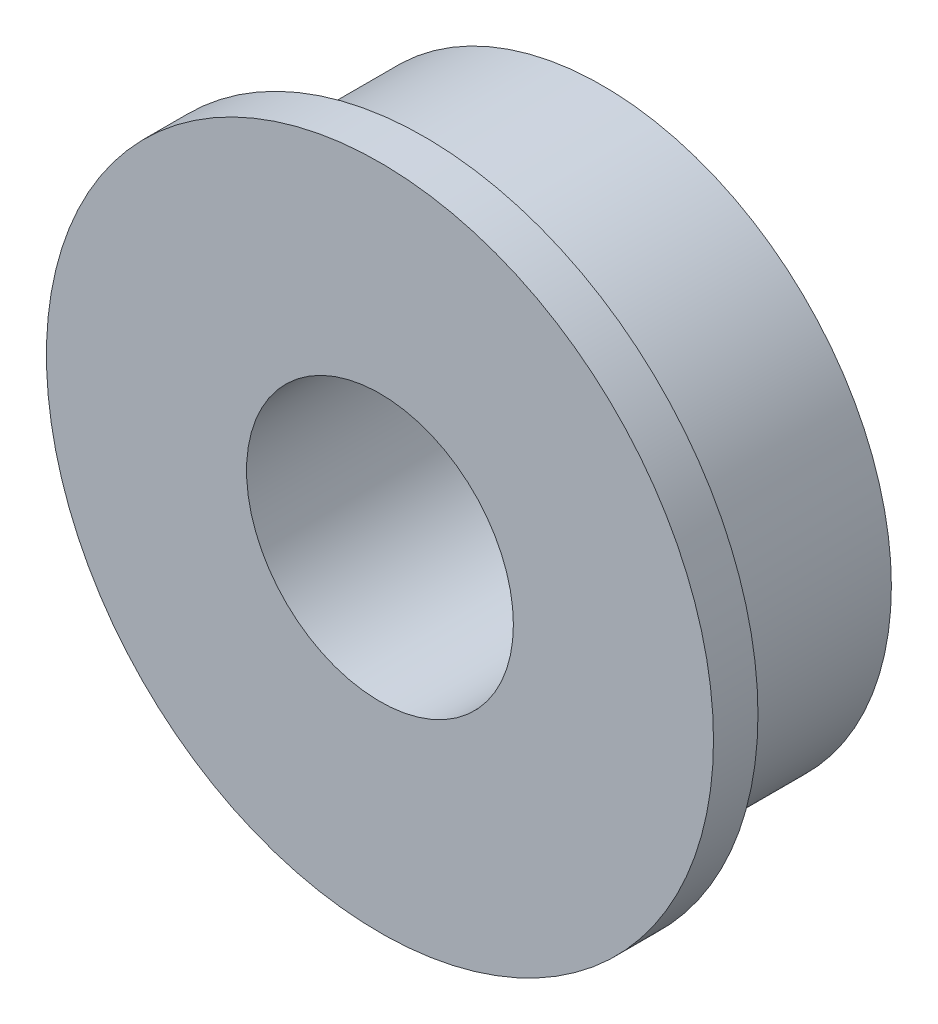
ISO-10303-21;
HEADER;
FILE_DESCRIPTION(('STEP AP214'),'2;1');
FILE_NAME('part.step','',(''),(''),'','','');
FILE_SCHEMA(('AUTOMOTIVE_DESIGN { 1 0 10303 214 1 1 1 1 }'));
ENDSEC;
DATA;
#1=APPLICATION_CONTEXT('core data for automotive mechanical design processes');
#2=APPLICATION_PROTOCOL_DEFINITION('international standard','automotive_design',2000,#1);
#3=PRODUCT_CONTEXT('',#1,'mechanical');
#4=PRODUCT('Part','Part','',(#3));
#5=PRODUCT_RELATED_PRODUCT_CATEGORY('part','',(#4));
#6=PRODUCT_DEFINITION_FORMATION('','',#4);
#7=PRODUCT_DEFINITION_CONTEXT('part definition',#1,'design');
#8=PRODUCT_DEFINITION('design','',#6,#7);
#9=PRODUCT_DEFINITION_SHAPE('','',#8);
#10=(LENGTH_UNIT() NAMED_UNIT(*) SI_UNIT(.MILLI.,.METRE.));
#11=(NAMED_UNIT(*) PLANE_ANGLE_UNIT() SI_UNIT($,.RADIAN.));
#12=(NAMED_UNIT(*) SI_UNIT($,.STERADIAN.) SOLID_ANGLE_UNIT());
#13=UNCERTAINTY_MEASURE_WITH_UNIT(LENGTH_MEASURE(1.E-05),#10,'distance_accuracy_value','');
#14=(GEOMETRIC_REPRESENTATION_CONTEXT(3) GLOBAL_UNCERTAINTY_ASSIGNED_CONTEXT((#13)) GLOBAL_UNIT_ASSIGNED_CONTEXT((#10,
#11,#12)) REPRESENTATION_CONTEXT('',''));
#15=CARTESIAN_POINT('',(0.,0.,0.));
#16=DIRECTION('',(0.,0.,1.));
#17=DIRECTION('',(1.,0.,0.));
#18=AXIS2_PLACEMENT_3D('',#15,#16,#17);
#19=CARTESIAN_POINT('',(0.,0.,0.));
#20=DIRECTION('',(0.,0.,1.));
#21=DIRECTION('',(1.,0.,0.));
#22=AXIS2_PLACEMENT_3D('',#19,#20,#21);
#23=CYLINDRICAL_SURFACE('',#22,3.);
#24=CARTESIAN_POINT('',(0.,0.,-5.));
#25=DIRECTION('',(0.,0.,1.));
#26=DIRECTION('',(1.,0.,0.));
#27=AXIS2_PLACEMENT_3D('',#24,#25,#26);
#28=CIRCLE('',#27,3.);
#29=CARTESIAN_POINT('',(3.,0.,-5.));
#30=VERTEX_POINT('',#29);
#31=EDGE_CURVE('E56',#30,#30,#28,.T.);
#32=ORIENTED_EDGE('',*,*,#31,.F.);
#33=EDGE_LOOP('',(#32));
#34=FACE_BOUND('',#33,.T.);
#35=CARTESIAN_POINT('',(0.,0.,0.));
#36=DIRECTION('',(0.,0.,1.));
#37=DIRECTION('',(1.,0.,0.));
#38=AXIS2_PLACEMENT_3D('',#35,#36,#37);
#39=CIRCLE('',#38,3.);
#40=CARTESIAN_POINT('',(3.,0.,0.));
#41=VERTEX_POINT('',#40);
#42=EDGE_CURVE('E10',#41,#41,#39,.T.);
#43=ORIENTED_EDGE('',*,*,#42,.T.);
#44=EDGE_LOOP('',(#43));
#45=FACE_BOUND('',#44,.T.);
#46=ADVANCED_FACE('F34',(#34,#45),#23,.F.);
#47=CARTESIAN_POINT('',(0.,3.,0.));
#48=DIRECTION('',(0.,0.,-1.));
#49=DIRECTION('',(-1.,0.,0.));
#50=AXIS2_PLACEMENT_3D('',#47,#48,#49);
#51=PLANE('',#50);
#52=ORIENTED_EDGE('',*,*,#42,.F.);
#53=EDGE_LOOP('',(#52));
#54=FACE_BOUND('',#53,.T.);
#55=CARTESIAN_POINT('',(0.,0.,0.));
#56=DIRECTION('',(0.,0.,1.));
#57=DIRECTION('',(1.,0.,0.));
#58=AXIS2_PLACEMENT_3D('',#55,#56,#57);
#59=CIRCLE('',#58,7.5);
#60=CARTESIAN_POINT('',(7.5,0.,0.));
#61=VERTEX_POINT('',#60);
#62=EDGE_CURVE('E40',#61,#61,#59,.T.);
#63=ORIENTED_EDGE('',*,*,#62,.T.);
#64=EDGE_LOOP('',(#63));
#65=FACE_BOUND('',#64,.T.);
#66=ADVANCED_FACE('F63',(#54,#65),#51,.F.);
#67=CARTESIAN_POINT('',(0.,0.,0.));
#68=DIRECTION('',(0.,0.,1.));
#69=DIRECTION('',(1.,0.,0.));
#70=AXIS2_PLACEMENT_3D('',#67,#68,#69);
#71=CYLINDRICAL_SURFACE('',#70,7.5);
#72=ORIENTED_EDGE('',*,*,#62,.F.);
#73=EDGE_LOOP('',(#72));
#74=FACE_BOUND('',#73,.T.);
#75=CARTESIAN_POINT('',(0.,0.,-1.));
#76=DIRECTION('',(0.,0.,1.));
#77=DIRECTION('',(1.,0.,0.));
#78=AXIS2_PLACEMENT_3D('',#75,#76,#77);
#79=CIRCLE('',#78,7.5);
#80=CARTESIAN_POINT('',(7.5,0.,-1.));
#81=VERTEX_POINT('',#80);
#82=EDGE_CURVE('E44',#81,#81,#79,.T.);
#83=ORIENTED_EDGE('',*,*,#82,.T.);
#84=EDGE_LOOP('',(#83));
#85=FACE_BOUND('',#84,.T.);
#86=ADVANCED_FACE('F67',(#74,#85),#71,.T.);
#87=CARTESIAN_POINT('',(0.,7.5,-1.));
#88=DIRECTION('',(0.,0.,1.));
#89=DIRECTION('',(1.,0.,0.));
#90=AXIS2_PLACEMENT_3D('',#87,#88,#89);
#91=PLANE('',#90);
#92=ORIENTED_EDGE('',*,*,#82,.F.);
#93=EDGE_LOOP('',(#92));
#94=FACE_BOUND('',#93,.T.);
#95=CARTESIAN_POINT('',(0.,0.,-1.));
#96=DIRECTION('',(0.,0.,1.));
#97=DIRECTION('',(1.,0.,0.));
#98=AXIS2_PLACEMENT_3D('',#95,#96,#97);
#99=CIRCLE('',#98,6.5);
#100=CARTESIAN_POINT('',(6.5,0.,-1.));
#101=VERTEX_POINT('',#100);
#102=EDGE_CURVE('E48',#101,#101,#99,.T.);
#103=ORIENTED_EDGE('',*,*,#102,.T.);
#104=EDGE_LOOP('',(#103));
#105=FACE_BOUND('',#104,.T.);
#106=ADVANCED_FACE('F72',(#94,#105),#91,.F.);
#107=CARTESIAN_POINT('',(0.,0.,0.));
#108=DIRECTION('',(0.,0.,1.));
#109=DIRECTION('',(1.,0.,0.));
#110=AXIS2_PLACEMENT_3D('',#107,#108,#109);
#111=CYLINDRICAL_SURFACE('',#110,6.5);
#112=ORIENTED_EDGE('',*,*,#102,.F.);
#113=EDGE_LOOP('',(#112));
#114=FACE_BOUND('',#113,.T.);
#115=CARTESIAN_POINT('',(0.,0.,-5.));
#116=DIRECTION('',(0.,0.,1.));
#117=DIRECTION('',(1.,0.,0.));
#118=AXIS2_PLACEMENT_3D('',#115,#116,#117);
#119=CIRCLE('',#118,6.5);
#120=CARTESIAN_POINT('',(6.5,0.,-5.));
#121=VERTEX_POINT('',#120);
#122=EDGE_CURVE('E53',#121,#121,#119,.T.);
#123=ORIENTED_EDGE('',*,*,#122,.T.);
#124=EDGE_LOOP('',(#123));
#125=FACE_BOUND('',#124,.T.);
#126=ADVANCED_FACE('F78',(#114,#125),#111,.T.);
#127=CARTESIAN_POINT('',(0.,6.5,-5.));
#128=DIRECTION('',(0.,0.,1.));
#129=DIRECTION('',(1.,0.,0.));
#130=AXIS2_PLACEMENT_3D('',#127,#128,#129);
#131=PLANE('',#130);
#132=ORIENTED_EDGE('',*,*,#122,.F.);
#133=EDGE_LOOP('',(#132));
#134=FACE_BOUND('',#133,.T.);
#135=ORIENTED_EDGE('',*,*,#31,.T.);
#136=EDGE_LOOP('',(#135));
#137=FACE_BOUND('',#136,.T.);
#138=ADVANCED_FACE('F60',(#134,#137),#131,.F.);
#139=CLOSED_SHELL('',(#46,#66,#86,#106,#126,#138));
#140=MANIFOLD_SOLID_BREP('B2',#139);
#141=ADVANCED_BREP_SHAPE_REPRESENTATION('',(#18,#140),#14);
#142=SHAPE_DEFINITION_REPRESENTATION(#9,#141);
ENDSEC;
END-ISO-10303-21;
